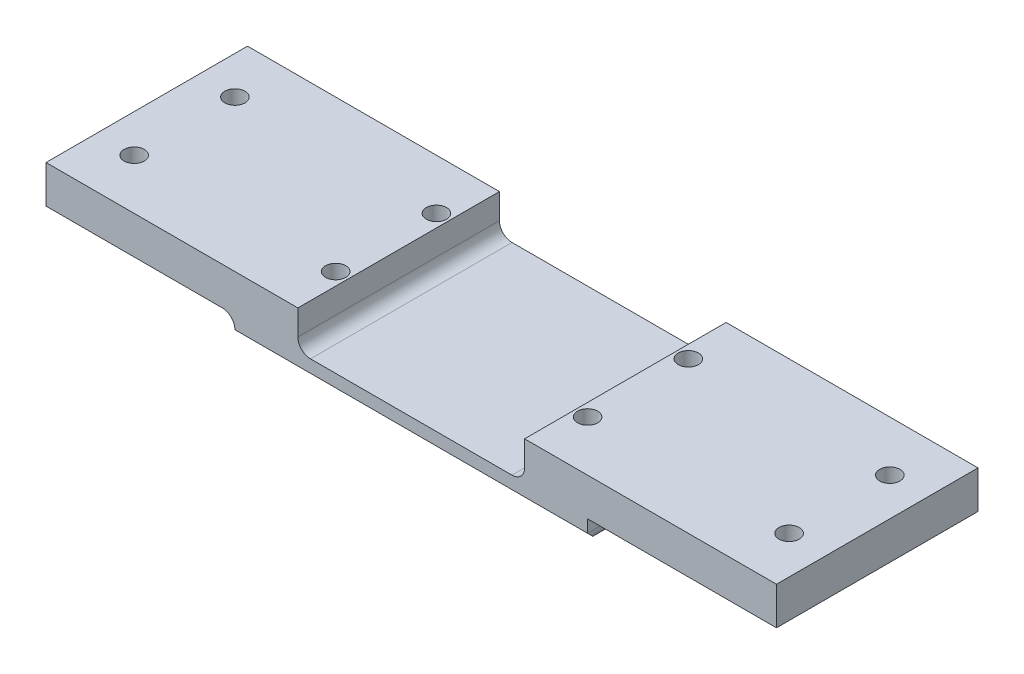
ISO-10303-21;
HEADER;
FILE_DESCRIPTION(('STEP AP214'),'2;1');
FILE_NAME('part.step','',(''),(''),'','','');
FILE_SCHEMA(('AUTOMOTIVE_DESIGN { 1 0 10303 214 1 1 1 1 }'));
ENDSEC;
DATA;
#1=APPLICATION_CONTEXT('core data for automotive mechanical design processes');
#2=APPLICATION_PROTOCOL_DEFINITION('international standard','automotive_design',2000,#1);
#3=PRODUCT_CONTEXT('',#1,'mechanical');
#4=PRODUCT('Part','Part','',(#3));
#5=PRODUCT_RELATED_PRODUCT_CATEGORY('part','',(#4));
#6=PRODUCT_DEFINITION_FORMATION('','',#4);
#7=PRODUCT_DEFINITION_CONTEXT('part definition',#1,'design');
#8=PRODUCT_DEFINITION('design','',#6,#7);
#9=PRODUCT_DEFINITION_SHAPE('','',#8);
#10=(LENGTH_UNIT() NAMED_UNIT(*) SI_UNIT(.MILLI.,.METRE.));
#11=(NAMED_UNIT(*) PLANE_ANGLE_UNIT() SI_UNIT($,.RADIAN.));
#12=(NAMED_UNIT(*) SI_UNIT($,.STERADIAN.) SOLID_ANGLE_UNIT());
#13=UNCERTAINTY_MEASURE_WITH_UNIT(LENGTH_MEASURE(1.E-05),#10,'distance_accuracy_value','');
#14=(GEOMETRIC_REPRESENTATION_CONTEXT(3) GLOBAL_UNCERTAINTY_ASSIGNED_CONTEXT((#13)) GLOBAL_UNIT_ASSIGNED_CONTEXT((#10,
#11,#12)) REPRESENTATION_CONTEXT('',''));
#15=CARTESIAN_POINT('',(0.,0.,0.));
#16=DIRECTION('',(0.,0.,1.));
#17=DIRECTION('',(1.,0.,0.));
#18=AXIS2_PLACEMENT_3D('',#15,#16,#17);
#19=CARTESIAN_POINT('',(0.,9.525,0.));
#20=DIRECTION('',(0.,-1.,0.));
#21=DIRECTION('',(0.,0.,-1.));
#22=AXIS2_PLACEMENT_3D('',#19,#20,#21);
#23=PLANE('',#22);
#24=CARTESIAN_POINT('',(123.825,9.525,-38.1));
#25=DIRECTION('',(0.,1.,0.));
#26=DIRECTION('',(0.,0.,1.));
#27=AXIS2_PLACEMENT_3D('',#24,#25,#26);
#28=CIRCLE('',#27,2.55270000000001);
#29=CARTESIAN_POINT('',(123.825,9.525,-35.5473));
#30=VERTEX_POINT('',#29);
#31=EDGE_CURVE('E392',#30,#30,#28,.T.);
#32=ORIENTED_EDGE('',*,*,#31,.F.);
#33=EDGE_LOOP('',(#32));
#34=FACE_BOUND('',#33,.T.);
#35=CARTESIAN_POINT('',(123.825,9.525,-12.7));
#36=DIRECTION('',(0.,1.,0.));
#37=DIRECTION('',(0.,0.,1.));
#38=AXIS2_PLACEMENT_3D('',#35,#36,#37);
#39=CIRCLE('',#38,2.55270000000001);
#40=CARTESIAN_POINT('',(123.825,9.525,-10.1473));
#41=VERTEX_POINT('',#40);
#42=EDGE_CURVE('E398',#41,#41,#39,.T.);
#43=ORIENTED_EDGE('',*,*,#42,.F.);
#44=EDGE_LOOP('',(#43));
#45=FACE_BOUND('',#44,.T.);
#46=CARTESIAN_POINT('',(174.625,9.525,-12.7));
#47=DIRECTION('',(0.,1.,0.));
#48=DIRECTION('',(0.,0.,1.));
#49=AXIS2_PLACEMENT_3D('',#46,#47,#48);
#50=CIRCLE('',#49,2.55269999999999);
#51=CARTESIAN_POINT('',(174.625,9.525,-10.1473));
#52=VERTEX_POINT('',#51);
#53=EDGE_CURVE('E404',#52,#52,#50,.T.);
#54=ORIENTED_EDGE('',*,*,#53,.F.);
#55=EDGE_LOOP('',(#54));
#56=FACE_BOUND('',#55,.T.);
#57=CARTESIAN_POINT('',(174.625,9.525,-38.1));
#58=DIRECTION('',(0.,1.,0.));
#59=DIRECTION('',(0.,0.,1.));
#60=AXIS2_PLACEMENT_3D('',#57,#58,#59);
#61=CIRCLE('',#60,2.55269999999999);
#62=CARTESIAN_POINT('',(174.625,9.525,-35.5473));
#63=VERTEX_POINT('',#62);
#64=EDGE_CURVE('E410',#63,#63,#61,.T.);
#65=ORIENTED_EDGE('',*,*,#64,.F.);
#66=EDGE_LOOP('',(#65));
#67=FACE_BOUND('',#66,.T.);
#68=DIRECTION('',(-1.,0.,0.));
#69=VECTOR('',#68,1.);
#70=CARTESIAN_POINT('',(0.,9.525,-50.8));
#71=LINE('',#70,#69);
#72=CARTESIAN_POINT('',(184.15,9.525,-50.8));
#73=VERTEX_POINT('',#72);
#74=CARTESIAN_POINT('',(120.65,9.525,-50.8));
#75=VERTEX_POINT('',#74);
#76=EDGE_CURVE('E155',#73,#75,#71,.T.);
#77=ORIENTED_EDGE('',*,*,#76,.T.);
#78=DIRECTION('',(0.,0.,-1.));
#79=VECTOR('',#78,1.);
#80=CARTESIAN_POINT('',(120.65,9.525,-50.8));
#81=LINE('',#80,#79);
#82=CARTESIAN_POINT('',(120.65,9.525,0.));
#83=VERTEX_POINT('',#82);
#84=EDGE_CURVE('E164',#83,#75,#81,.T.);
#85=ORIENTED_EDGE('',*,*,#84,.F.);
#86=DIRECTION('',(1.,0.,0.));
#87=VECTOR('',#86,1.);
#88=CARTESIAN_POINT('',(0.,9.525,0.));
#89=LINE('',#88,#87);
#90=CARTESIAN_POINT('',(184.15,9.525,0.));
#91=VERTEX_POINT('',#90);
#92=EDGE_CURVE('E275',#83,#91,#89,.T.);
#93=ORIENTED_EDGE('',*,*,#92,.T.);
#94=DIRECTION('',(0.,0.,-1.));
#95=VECTOR('',#94,1.);
#96=CARTESIAN_POINT('',(184.15,9.525,0.));
#97=LINE('',#96,#95);
#98=EDGE_CURVE('E174',#91,#73,#97,.T.);
#99=ORIENTED_EDGE('',*,*,#98,.T.);
#100=EDGE_LOOP('',(#77,#85,#93,#99));
#101=FACE_BOUND('',#100,.T.);
#102=ADVANCED_FACE('F37',(#34,#45,#56,#67,#101),#23,.F.);
#103=CARTESIAN_POINT('',(0.,0.,0.));
#104=DIRECTION('',(0.,-1.,0.));
#105=DIRECTION('',(0.,0.,-1.));
#106=AXIS2_PLACEMENT_3D('',#103,#104,#105);
#107=PLANE('',#106);
#108=CARTESIAN_POINT('',(9.52500000000001,0.,-38.1));
#109=DIRECTION('',(0.,-1.,0.));
#110=DIRECTION('',(0.,0.,-1.));
#111=AXIS2_PLACEMENT_3D('',#108,#109,#110);
#112=CIRCLE('',#111,2.5527);
#113=CARTESIAN_POINT('',(9.52500000000001,0.,-40.6527));
#114=VERTEX_POINT('',#113);
#115=EDGE_CURVE('E370',#114,#114,#112,.T.);
#116=ORIENTED_EDGE('',*,*,#115,.F.);
#117=EDGE_LOOP('',(#116));
#118=FACE_BOUND('',#117,.T.);
#119=CARTESIAN_POINT('',(9.525,0.,-12.7));
#120=DIRECTION('',(0.,-1.,0.));
#121=DIRECTION('',(0.,0.,-1.));
#122=AXIS2_PLACEMENT_3D('',#119,#120,#121);
#123=CIRCLE('',#122,2.5527);
#124=CARTESIAN_POINT('',(9.525,0.,-15.2527));
#125=VERTEX_POINT('',#124);
#126=EDGE_CURVE('E374',#125,#125,#123,.T.);
#127=ORIENTED_EDGE('',*,*,#126,.F.);
#128=EDGE_LOOP('',(#127));
#129=FACE_BOUND('',#128,.T.);
#130=DIRECTION('',(-1.,0.,0.));
#131=VECTOR('',#130,1.);
#132=CARTESIAN_POINT('',(0.,0.,-50.8));
#133=LINE('',#132,#131);
#134=CARTESIAN_POINT('',(44.45,0.,-50.8));
#135=VERTEX_POINT('',#134);
#136=CARTESIAN_POINT('',(0.,0.,-50.8));
#137=VERTEX_POINT('',#136);
#138=EDGE_CURVE('E195',#135,#137,#133,.T.);
#139=ORIENTED_EDGE('',*,*,#138,.F.);
#140=DIRECTION('',(0.,0.,1.));
#141=VECTOR('',#140,1.);
#142=CARTESIAN_POINT('',(44.45,0.,0.));
#143=LINE('',#142,#141);
#144=CARTESIAN_POINT('',(44.45,0.,0.));
#145=VERTEX_POINT('',#144);
#146=EDGE_CURVE('E207',#135,#145,#143,.T.);
#147=ORIENTED_EDGE('',*,*,#146,.T.);
#148=DIRECTION('',(1.,0.,0.));
#149=VECTOR('',#148,1.);
#150=CARTESIAN_POINT('',(0.,0.,0.));
#151=LINE('',#150,#149);
#152=CARTESIAN_POINT('',(0.,0.,0.));
#153=VERTEX_POINT('',#152);
#154=EDGE_CURVE('E190',#153,#145,#151,.T.);
#155=ORIENTED_EDGE('',*,*,#154,.F.);
#156=DIRECTION('',(0.,0.,1.));
#157=VECTOR('',#156,1.);
#158=CARTESIAN_POINT('',(0.,0.,0.));
#159=LINE('',#158,#157);
#160=EDGE_CURVE('E185',#137,#153,#159,.T.);
#161=ORIENTED_EDGE('',*,*,#160,.F.);
#162=EDGE_LOOP('',(#139,#147,#155,#161));
#163=FACE_BOUND('',#162,.T.);
#164=ADVANCED_FACE('F291',(#118,#129,#163),#107,.T.);
#165=CARTESIAN_POINT('',(0.,9.525,0.));
#166=DIRECTION('',(1.,0.,0.));
#167=DIRECTION('',(0.,0.,-1.));
#168=AXIS2_PLACEMENT_3D('',#165,#166,#167);
#169=PLANE('',#168);
#170=ORIENTED_EDGE('',*,*,#160,.T.);
#171=DIRECTION('',(0.,-1.,0.));
#172=VECTOR('',#171,1.);
#173=CARTESIAN_POINT('',(0.,9.525,0.));
#174=LINE('',#173,#172);
#175=CARTESIAN_POINT('',(0.,9.525,0.));
#176=VERTEX_POINT('',#175);
#177=EDGE_CURVE('E204',#176,#153,#174,.T.);
#178=ORIENTED_EDGE('',*,*,#177,.F.);
#179=DIRECTION('',(0.,0.,1.));
#180=VECTOR('',#179,1.);
#181=CARTESIAN_POINT('',(0.,9.525,0.));
#182=LINE('',#181,#180);
#183=CARTESIAN_POINT('',(0.,9.525,-50.8));
#184=VERTEX_POINT('',#183);
#185=EDGE_CURVE('E198',#184,#176,#182,.T.);
#186=ORIENTED_EDGE('',*,*,#185,.F.);
#187=DIRECTION('',(0.,-1.,0.));
#188=VECTOR('',#187,1.);
#189=CARTESIAN_POINT('',(0.,9.525,-50.8));
#190=LINE('',#189,#188);
#191=EDGE_CURVE('E176',#184,#137,#190,.T.);
#192=ORIENTED_EDGE('',*,*,#191,.T.);
#193=EDGE_LOOP('',(#170,#178,#186,#192));
#194=FACE_BOUND('',#193,.T.);
#195=ADVANCED_FACE('F305',(#194),#169,.F.);
#196=CARTESIAN_POINT('',(0.,9.525,0.));
#197=DIRECTION('',(0.,0.,-1.));
#198=DIRECTION('',(-1.,0.,0.));
#199=AXIS2_PLACEMENT_3D('',#196,#197,#198);
#200=PLANE('',#199);
#201=CARTESIAN_POINT('',(44.45,-3.175,0.));
#202=DIRECTION('',(0.,0.,-1.));
#203=DIRECTION('',(-1.,0.,0.));
#204=AXIS2_PLACEMENT_3D('',#201,#202,#203);
#205=CIRCLE('',#204,3.175);
#206=CARTESIAN_POINT('',(47.625,-3.17499999999999,0.));
#207=VERTEX_POINT('',#206);
#208=EDGE_CURVE('E230',#145,#207,#205,.T.);
#209=ORIENTED_EDGE('',*,*,#208,.T.);
#210=DIRECTION('',(1.,0.,0.));
#211=VECTOR('',#210,1.);
#212=CARTESIAN_POINT('',(133.35,-3.17499999999998,0.));
#213=LINE('',#212,#211);
#214=CARTESIAN_POINT('',(136.525,-3.175,0.));
#215=VERTEX_POINT('',#214);
#216=EDGE_CURVE('E242',#207,#215,#213,.T.);
#217=ORIENTED_EDGE('',*,*,#216,.T.);
#218=DIRECTION('',(0.,1.,0.));
#219=VECTOR('',#218,1.);
#220=CARTESIAN_POINT('',(136.525,0.,0.));
#221=LINE('',#220,#219);
#222=CARTESIAN_POINT('',(136.525,0.,0.));
#223=VERTEX_POINT('',#222);
#224=EDGE_CURVE('E253',#215,#223,#221,.T.);
#225=ORIENTED_EDGE('',*,*,#224,.T.);
#226=CARTESIAN_POINT('',(184.15,0.,0.));
#227=VERTEX_POINT('',#226);
#228=EDGE_CURVE('E188',#223,#227,#151,.T.);
#229=ORIENTED_EDGE('',*,*,#228,.T.);
#230=DIRECTION('',(0.,-1.,0.));
#231=VECTOR('',#230,1.);
#232=CARTESIAN_POINT('',(184.15,9.525,0.));
#233=LINE('',#232,#231);
#234=EDGE_CURVE('E201',#91,#227,#233,.T.);
#235=ORIENTED_EDGE('',*,*,#234,.F.);
#236=ORIENTED_EDGE('',*,*,#92,.F.);
#237=DIRECTION('',(0.,1.,0.));
#238=VECTOR('',#237,1.);
#239=CARTESIAN_POINT('',(120.65,0.,0.));
#240=LINE('',#239,#238);
#241=CARTESIAN_POINT('',(120.65,3.175,0.));
#242=VERTEX_POINT('',#241);
#243=EDGE_CURVE('E167',#242,#83,#240,.T.);
#244=ORIENTED_EDGE('',*,*,#243,.F.);
#245=CARTESIAN_POINT('',(117.475,3.175,0.));
#246=DIRECTION('',(0.,0.,-1.));
#247=DIRECTION('',(-1.,0.,0.));
#248=AXIS2_PLACEMENT_3D('',#245,#246,#247);
#249=CIRCLE('',#248,3.175);
#250=CARTESIAN_POINT('',(117.475,0.,0.));
#251=VERTEX_POINT('',#250);
#252=EDGE_CURVE('E240',#242,#251,#249,.T.);
#253=ORIENTED_EDGE('',*,*,#252,.T.);
#254=DIRECTION('',(1.,0.,0.));
#255=VECTOR('',#254,1.);
#256=CARTESIAN_POINT('',(120.65,0.,0.));
#257=LINE('',#256,#255);
#258=CARTESIAN_POINT('',(66.675,0.,0.));
#259=VERTEX_POINT('',#258);
#260=EDGE_CURVE('E161',#259,#251,#257,.T.);
#261=ORIENTED_EDGE('',*,*,#260,.F.);
#262=CARTESIAN_POINT('',(66.675,3.175,0.));
#263=DIRECTION('',(0.,0.,-1.));
#264=DIRECTION('',(-1.,0.,0.));
#265=AXIS2_PLACEMENT_3D('',#262,#263,#264);
#266=CIRCLE('',#265,3.175);
#267=CARTESIAN_POINT('',(63.5,3.175,0.));
#268=VERTEX_POINT('',#267);
#269=EDGE_CURVE('E235',#259,#268,#266,.T.);
#270=ORIENTED_EDGE('',*,*,#269,.T.);
#271=DIRECTION('',(0.,1.,0.));
#272=VECTOR('',#271,1.);
#273=CARTESIAN_POINT('',(63.5,0.,0.));
#274=LINE('',#273,#272);
#275=CARTESIAN_POINT('',(63.5,9.525,0.));
#276=VERTEX_POINT('',#275);
#277=EDGE_CURVE('E423',#268,#276,#274,.T.);
#278=ORIENTED_EDGE('',*,*,#277,.T.);
#279=EDGE_CURVE('E276',#176,#276,#89,.T.);
#280=ORIENTED_EDGE('',*,*,#279,.F.);
#281=ORIENTED_EDGE('',*,*,#177,.T.);
#282=ORIENTED_EDGE('',*,*,#154,.T.);
#283=EDGE_LOOP('',(#209,#217,#225,#229,#235,#236,#244,#253,#261,#270,#278,#280,#281,#282));
#284=FACE_BOUND('',#283,.T.);
#285=ADVANCED_FACE('F252',(#284),#200,.F.);
#286=CARTESIAN_POINT('',(184.15,9.525,0.));
#287=DIRECTION('',(-1.,0.,0.));
#288=DIRECTION('',(0.,0.,1.));
#289=AXIS2_PLACEMENT_3D('',#286,#287,#288);
#290=PLANE('',#289);
#291=DIRECTION('',(0.,0.,-1.));
#292=VECTOR('',#291,1.);
#293=CARTESIAN_POINT('',(184.15,0.,0.));
#294=LINE('',#293,#292);
#295=CARTESIAN_POINT('',(184.15,0.,-50.8));
#296=VERTEX_POINT('',#295);
#297=EDGE_CURVE('E193',#227,#296,#294,.T.);
#298=ORIENTED_EDGE('',*,*,#297,.T.);
#299=DIRECTION('',(0.,-1.,0.));
#300=VECTOR('',#299,1.);
#301=CARTESIAN_POINT('',(184.15,9.525,-50.8));
#302=LINE('',#301,#300);
#303=EDGE_CURVE('E180',#73,#296,#302,.T.);
#304=ORIENTED_EDGE('',*,*,#303,.F.);
#305=ORIENTED_EDGE('',*,*,#98,.F.);
#306=ORIENTED_EDGE('',*,*,#234,.T.);
#307=EDGE_LOOP('',(#298,#304,#305,#306));
#308=FACE_BOUND('',#307,.T.);
#309=ADVANCED_FACE('F283',(#308),#290,.F.);
#310=CARTESIAN_POINT('',(0.,9.525,-50.8));
#311=DIRECTION('',(0.,0.,1.));
#312=DIRECTION('',(1.,0.,0.));
#313=AXIS2_PLACEMENT_3D('',#310,#311,#312);
#314=PLANE('',#313);
#315=DIRECTION('',(-1.,0.,0.));
#316=VECTOR('',#315,1.);
#317=CARTESIAN_POINT('',(47.625,-6.35,-50.8));
#318=LINE('',#317,#316);
#319=CARTESIAN_POINT('',(133.35,-6.34999999999999,-50.8));
#320=VERTEX_POINT('',#319);
#321=CARTESIAN_POINT('',(50.8,-6.35,-50.8));
#322=VERTEX_POINT('',#321);
#323=EDGE_CURVE('E189',#320,#322,#318,.T.);
#324=ORIENTED_EDGE('',*,*,#323,.T.);
#325=CARTESIAN_POINT('',(50.8,-3.175,-50.8));
#326=DIRECTION('',(0.,0.,1.));
#327=DIRECTION('',(1.,0.,0.));
#328=AXIS2_PLACEMENT_3D('',#325,#326,#327);
#329=CIRCLE('',#328,3.175);
#330=CARTESIAN_POINT('',(47.625,-3.17499999999999,-50.8));
#331=VERTEX_POINT('',#330);
#332=EDGE_CURVE('E216',#322,#331,#329,.F.);
#333=ORIENTED_EDGE('',*,*,#332,.T.);
#334=CARTESIAN_POINT('',(44.45,-3.175,-50.8));
#335=DIRECTION('',(0.,0.,1.));
#336=DIRECTION('',(1.,0.,0.));
#337=AXIS2_PLACEMENT_3D('',#334,#335,#336);
#338=CIRCLE('',#337,3.175);
#339=EDGE_CURVE('E233',#331,#135,#338,.T.);
#340=ORIENTED_EDGE('',*,*,#339,.T.);
#341=ORIENTED_EDGE('',*,*,#138,.T.);
#342=ORIENTED_EDGE('',*,*,#191,.F.);
#343=CARTESIAN_POINT('',(63.5,9.525,-50.8));
#344=VERTEX_POINT('',#343);
#345=EDGE_CURVE('E177',#344,#184,#71,.T.);
#346=ORIENTED_EDGE('',*,*,#345,.F.);
#347=DIRECTION('',(0.,1.,0.));
#348=VECTOR('',#347,1.);
#349=CARTESIAN_POINT('',(63.5,0.,-50.8));
#350=LINE('',#349,#348);
#351=CARTESIAN_POINT('',(63.5,3.175,-50.8));
#352=VERTEX_POINT('',#351);
#353=EDGE_CURVE('E160',#352,#344,#350,.T.);
#354=ORIENTED_EDGE('',*,*,#353,.F.);
#355=CARTESIAN_POINT('',(66.675,3.175,-50.8));
#356=DIRECTION('',(0.,0.,1.));
#357=DIRECTION('',(1.,0.,0.));
#358=AXIS2_PLACEMENT_3D('',#355,#356,#357);
#359=CIRCLE('',#358,3.175);
#360=CARTESIAN_POINT('',(66.675,0.,-50.8));
#361=VERTEX_POINT('',#360);
#362=EDGE_CURVE('E237',#352,#361,#359,.T.);
#363=ORIENTED_EDGE('',*,*,#362,.T.);
#364=DIRECTION('',(-1.,0.,0.));
#365=VECTOR('',#364,1.);
#366=CARTESIAN_POINT('',(120.65,0.,-50.8));
#367=LINE('',#366,#365);
#368=CARTESIAN_POINT('',(117.475,0.,-50.8));
#369=VERTEX_POINT('',#368);
#370=EDGE_CURVE('E415',#369,#361,#367,.T.);
#371=ORIENTED_EDGE('',*,*,#370,.F.);
#372=CARTESIAN_POINT('',(117.475,3.175,-50.8));
#373=DIRECTION('',(0.,0.,1.));
#374=DIRECTION('',(1.,0.,0.));
#375=AXIS2_PLACEMENT_3D('',#372,#373,#374);
#376=CIRCLE('',#375,3.175);
#377=CARTESIAN_POINT('',(120.65,3.175,-50.8));
#378=VERTEX_POINT('',#377);
#379=EDGE_CURVE('E157',#369,#378,#376,.T.);
#380=ORIENTED_EDGE('',*,*,#379,.T.);
#381=DIRECTION('',(0.,1.,0.));
#382=VECTOR('',#381,1.);
#383=CARTESIAN_POINT('',(120.65,0.,-50.8));
#384=LINE('',#383,#382);
#385=EDGE_CURVE('E149',#378,#75,#384,.T.);
#386=ORIENTED_EDGE('',*,*,#385,.T.);
#387=ORIENTED_EDGE('',*,*,#76,.F.);
#388=ORIENTED_EDGE('',*,*,#303,.T.);
#389=CARTESIAN_POINT('',(136.525,0.,-50.8));
#390=VERTEX_POINT('',#389);
#391=EDGE_CURVE('E196',#296,#390,#133,.T.);
#392=ORIENTED_EDGE('',*,*,#391,.T.);
#393=DIRECTION('',(0.,-1.,0.));
#394=VECTOR('',#393,1.);
#395=CARTESIAN_POINT('',(136.525,0.,-50.8));
#396=LINE('',#395,#394);
#397=CARTESIAN_POINT('',(136.525,-3.175,-50.8));
#398=VERTEX_POINT('',#397);
#399=EDGE_CURVE('E268',#390,#398,#396,.T.);
#400=ORIENTED_EDGE('',*,*,#399,.T.);
#401=CARTESIAN_POINT('',(133.35,-3.17499999999999,-50.8));
#402=DIRECTION('',(0.,0.,1.));
#403=DIRECTION('',(1.,0.,0.));
#404=AXIS2_PLACEMENT_3D('',#401,#402,#403);
#405=CIRCLE('',#404,3.175);
#406=EDGE_CURVE('E214',#398,#320,#405,.F.);
#407=ORIENTED_EDGE('',*,*,#406,.T.);
#408=EDGE_LOOP('',(#324,#333,#340,#341,#342,#346,#354,#363,#371,#380,#386,#387,#388,#392,#400,#407));
#409=FACE_BOUND('',#408,.T.);
#410=ADVANCED_FACE('F152',(#409),#314,.F.);
#411=CARTESIAN_POINT('',(9.52500000000001,9.525,-38.1));
#412=DIRECTION('',(0.,1.,0.));
#413=DIRECTION('',(0.,0.,1.));
#414=AXIS2_PLACEMENT_3D('',#411,#412,#413);
#415=CIRCLE('',#414,2.5527);
#416=CARTESIAN_POINT('',(9.52500000000001,9.525,-35.5473));
#417=VERTEX_POINT('',#416);
#418=EDGE_CURVE('E246',#417,#417,#415,.T.);
#419=ORIENTED_EDGE('',*,*,#418,.F.);
#420=EDGE_LOOP('',(#419));
#421=FACE_BOUND('',#420,.T.);
#422=CARTESIAN_POINT('',(9.525,9.525,-12.7));
#423=DIRECTION('',(0.,1.,0.));
#424=DIRECTION('',(0.,0.,1.));
#425=AXIS2_PLACEMENT_3D('',#422,#423,#424);
#426=CIRCLE('',#425,2.5527);
#427=CARTESIAN_POINT('',(9.525,9.525,-10.1473));
#428=VERTEX_POINT('',#427);
#429=EDGE_CURVE('E371',#428,#428,#426,.T.);
#430=ORIENTED_EDGE('',*,*,#429,.F.);
#431=EDGE_LOOP('',(#430));
#432=FACE_BOUND('',#431,.T.);
#433=CARTESIAN_POINT('',(60.325,9.525,-12.7));
#434=DIRECTION('',(0.,1.,0.));
#435=DIRECTION('',(0.,0.,1.));
#436=AXIS2_PLACEMENT_3D('',#433,#434,#435);
#437=CIRCLE('',#436,2.5527);
#438=CARTESIAN_POINT('',(60.325,9.525,-10.1473));
#439=VERTEX_POINT('',#438);
#440=EDGE_CURVE('E380',#439,#439,#437,.T.);
#441=ORIENTED_EDGE('',*,*,#440,.F.);
#442=EDGE_LOOP('',(#441));
#443=FACE_BOUND('',#442,.T.);
#444=CARTESIAN_POINT('',(60.325,9.525,-38.1));
#445=DIRECTION('',(0.,1.,0.));
#446=DIRECTION('',(0.,0.,1.));
#447=AXIS2_PLACEMENT_3D('',#444,#445,#446);
#448=CIRCLE('',#447,2.55270000000001);
#449=CARTESIAN_POINT('',(60.325,9.525,-35.5473));
#450=VERTEX_POINT('',#449);
#451=EDGE_CURVE('E386',#450,#450,#448,.T.);
#452=ORIENTED_EDGE('',*,*,#451,.F.);
#453=EDGE_LOOP('',(#452));
#454=FACE_BOUND('',#453,.T.);
#455=ORIENTED_EDGE('',*,*,#279,.T.);
#456=DIRECTION('',(0.,0.,1.));
#457=VECTOR('',#456,1.);
#458=CARTESIAN_POINT('',(63.5,9.525,-50.8));
#459=LINE('',#458,#457);
#460=EDGE_CURVE('E170',#344,#276,#459,.T.);
#461=ORIENTED_EDGE('',*,*,#460,.F.);
#462=ORIENTED_EDGE('',*,*,#345,.T.);
#463=ORIENTED_EDGE('',*,*,#185,.T.);
#464=EDGE_LOOP('',(#455,#461,#462,#463));
#465=FACE_BOUND('',#464,.T.);
#466=ADVANCED_FACE('F288',(#421,#432,#443,#454,#465),#23,.F.);
#467=CARTESIAN_POINT('',(174.625,0.,-12.7));
#468=DIRECTION('',(0.,-1.,0.));
#469=DIRECTION('',(0.,0.,-1.));
#470=AXIS2_PLACEMENT_3D('',#467,#468,#469);
#471=CIRCLE('',#470,2.55269999999999);
#472=CARTESIAN_POINT('',(174.625,0.,-15.2527));
#473=VERTEX_POINT('',#472);
#474=EDGE_CURVE('E407',#473,#473,#471,.T.);
#475=ORIENTED_EDGE('',*,*,#474,.F.);
#476=EDGE_LOOP('',(#475));
#477=FACE_BOUND('',#476,.T.);
#478=CARTESIAN_POINT('',(174.625,0.,-38.1));
#479=DIRECTION('',(0.,-1.,0.));
#480=DIRECTION('',(0.,0.,-1.));
#481=AXIS2_PLACEMENT_3D('',#478,#479,#480);
#482=CIRCLE('',#481,2.55269999999999);
#483=CARTESIAN_POINT('',(174.625,0.,-40.6527));
#484=VERTEX_POINT('',#483);
#485=EDGE_CURVE('E171',#484,#484,#482,.T.);
#486=ORIENTED_EDGE('',*,*,#485,.F.);
#487=EDGE_LOOP('',(#486));
#488=FACE_BOUND('',#487,.T.);
#489=DIRECTION('',(0.,0.,1.));
#490=VECTOR('',#489,1.);
#491=CARTESIAN_POINT('',(136.525,0.,-139.926497182376));
#492=LINE('',#491,#490);
#493=EDGE_CURVE('E262',#390,#223,#492,.T.);
#494=ORIENTED_EDGE('',*,*,#493,.F.);
#495=ORIENTED_EDGE('',*,*,#391,.F.);
#496=ORIENTED_EDGE('',*,*,#297,.F.);
#497=ORIENTED_EDGE('',*,*,#228,.F.);
#498=EDGE_LOOP('',(#494,#495,#496,#497));
#499=FACE_BOUND('',#498,.T.);
#500=ADVANCED_FACE('F286',(#477,#488,#499),#107,.T.);
#501=CARTESIAN_POINT('',(136.525,0.,-139.926497182376));
#502=DIRECTION('',(1.,0.,0.));
#503=DIRECTION('',(0.,1.,0.));
#504=AXIS2_PLACEMENT_3D('',#501,#502,#503);
#505=PLANE('',#504);
#506=ORIENTED_EDGE('',*,*,#224,.F.);
#507=DIRECTION('',(0.,0.,1.));
#508=VECTOR('',#507,1.);
#509=CARTESIAN_POINT('',(136.525,-3.175,-139.926497182376));
#510=LINE('',#509,#508);
#511=EDGE_CURVE('E218',#215,#398,#510,.F.);
#512=ORIENTED_EDGE('',*,*,#511,.T.);
#513=ORIENTED_EDGE('',*,*,#399,.F.);
#514=ORIENTED_EDGE('',*,*,#493,.T.);
#515=EDGE_LOOP('',(#506,#512,#513,#514));
#516=FACE_BOUND('',#515,.T.);
#517=ADVANCED_FACE('F259',(#516),#505,.T.);
#518=CARTESIAN_POINT('',(47.625,-6.35,-139.926497182376));
#519=DIRECTION('',(0.,-1.,0.));
#520=DIRECTION('',(1.,0.,0.));
#521=AXIS2_PLACEMENT_3D('',#518,#519,#520);
#522=PLANE('',#521);
#523=CARTESIAN_POINT('',(60.325,-6.35,-12.7));
#524=DIRECTION('',(0.,-1.,0.));
#525=DIRECTION('',(1.,0.,0.));
#526=AXIS2_PLACEMENT_3D('',#523,#524,#525);
#527=CIRCLE('',#526,2.5527);
#528=CARTESIAN_POINT('',(62.8777,-6.35,-12.7));
#529=VERTEX_POINT('',#528);
#530=EDGE_CURVE('E383',#529,#529,#527,.T.);
#531=ORIENTED_EDGE('',*,*,#530,.F.);
#532=EDGE_LOOP('',(#531));
#533=FACE_BOUND('',#532,.T.);
#534=CARTESIAN_POINT('',(60.325,-6.35,-38.1));
#535=DIRECTION('',(0.,-1.,0.));
#536=DIRECTION('',(1.,0.,0.));
#537=AXIS2_PLACEMENT_3D('',#534,#535,#536);
#538=CIRCLE('',#537,2.5527);
#539=CARTESIAN_POINT('',(62.8777,-6.35,-38.1));
#540=VERTEX_POINT('',#539);
#541=EDGE_CURVE('E389',#540,#540,#538,.T.);
#542=ORIENTED_EDGE('',*,*,#541,.F.);
#543=EDGE_LOOP('',(#542));
#544=FACE_BOUND('',#543,.T.);
#545=CARTESIAN_POINT('',(123.825,-6.34999999999999,-38.1));
#546=DIRECTION('',(0.,-1.,0.));
#547=DIRECTION('',(1.,0.,0.));
#548=AXIS2_PLACEMENT_3D('',#545,#546,#547);
#549=CIRCLE('',#548,2.55270000000001);
#550=CARTESIAN_POINT('',(126.3777,-6.34999999999999,-38.1));
#551=VERTEX_POINT('',#550);
#552=EDGE_CURVE('E395',#551,#551,#549,.T.);
#553=ORIENTED_EDGE('',*,*,#552,.F.);
#554=EDGE_LOOP('',(#553));
#555=FACE_BOUND('',#554,.T.);
#556=CARTESIAN_POINT('',(123.825,-6.34999999999999,-12.7));
#557=DIRECTION('',(0.,-1.,0.));
#558=DIRECTION('',(1.,0.,0.));
#559=AXIS2_PLACEMENT_3D('',#556,#557,#558);
#560=CIRCLE('',#559,2.55270000000001);
#561=CARTESIAN_POINT('',(126.3777,-6.34999999999999,-12.7));
#562=VERTEX_POINT('',#561);
#563=EDGE_CURVE('E401',#562,#562,#560,.T.);
#564=ORIENTED_EDGE('',*,*,#563,.F.);
#565=EDGE_LOOP('',(#564));
#566=FACE_BOUND('',#565,.T.);
#567=DIRECTION('',(0.,0.,1.));
#568=VECTOR('',#567,1.);
#569=CARTESIAN_POINT('',(133.35,-6.34999999999999,-139.926497182376));
#570=LINE('',#569,#568);
#571=CARTESIAN_POINT('',(133.35,-6.34999999999999,-3.17500000000004));
#572=VERTEX_POINT('',#571);
#573=EDGE_CURVE('E210',#320,#572,#570,.T.);
#574=ORIENTED_EDGE('',*,*,#573,.T.);
#575=DIRECTION('',(-1.,0.,0.));
#576=VECTOR('',#575,1.);
#577=CARTESIAN_POINT('',(50.8,-6.35,-3.17500000000004));
#578=LINE('',#577,#576);
#579=CARTESIAN_POINT('',(50.8,-6.35,-3.17500000000004));
#580=VERTEX_POINT('',#579);
#581=EDGE_CURVE('E45',#572,#580,#578,.T.);
#582=ORIENTED_EDGE('',*,*,#581,.T.);
#583=DIRECTION('',(0.,0.,1.));
#584=VECTOR('',#583,1.);
#585=CARTESIAN_POINT('',(50.8,-6.35,-139.926497182376));
#586=LINE('',#585,#584);
#587=EDGE_CURVE('E212',#580,#322,#586,.F.);
#588=ORIENTED_EDGE('',*,*,#587,.T.);
#589=ORIENTED_EDGE('',*,*,#323,.F.);
#590=EDGE_LOOP('',(#574,#582,#588,#589));
#591=FACE_BOUND('',#590,.T.);
#592=ADVANCED_FACE('F269',(#533,#544,#555,#566,#591),#522,.T.);
#593=CARTESIAN_POINT('',(120.65,0.,-50.8));
#594=DIRECTION('',(1.,0.,0.));
#595=DIRECTION('',(0.,0.,-1.));
#596=AXIS2_PLACEMENT_3D('',#593,#594,#595);
#597=PLANE('',#596);
#598=ORIENTED_EDGE('',*,*,#385,.F.);
#599=DIRECTION('',(0.,0.,-1.));
#600=VECTOR('',#599,1.);
#601=CARTESIAN_POINT('',(120.65,3.175,0.));
#602=LINE('',#601,#600);
#603=EDGE_CURVE('E228',#378,#242,#602,.F.);
#604=ORIENTED_EDGE('',*,*,#603,.T.);
#605=ORIENTED_EDGE('',*,*,#243,.T.);
#606=ORIENTED_EDGE('',*,*,#84,.T.);
#607=EDGE_LOOP('',(#598,#604,#605,#606));
#608=FACE_BOUND('',#607,.T.);
#609=ADVANCED_FACE('F165',(#608),#597,.F.);
#610=CARTESIAN_POINT('',(63.5,0.,-50.8));
#611=DIRECTION('',(-1.,0.,0.));
#612=DIRECTION('',(0.,0.,1.));
#613=AXIS2_PLACEMENT_3D('',#610,#611,#612);
#614=PLANE('',#613);
#615=ORIENTED_EDGE('',*,*,#277,.F.);
#616=DIRECTION('',(0.,0.,1.));
#617=VECTOR('',#616,1.);
#618=CARTESIAN_POINT('',(63.5,3.175,-50.8));
#619=LINE('',#618,#617);
#620=EDGE_CURVE('E226',#268,#352,#619,.F.);
#621=ORIENTED_EDGE('',*,*,#620,.T.);
#622=ORIENTED_EDGE('',*,*,#353,.T.);
#623=ORIENTED_EDGE('',*,*,#460,.T.);
#624=EDGE_LOOP('',(#615,#621,#622,#623));
#625=FACE_BOUND('',#624,.T.);
#626=ADVANCED_FACE('F319',(#625),#614,.F.);
#627=CARTESIAN_POINT('',(0.,0.,0.));
#628=DIRECTION('',(0.,-1.,0.));
#629=DIRECTION('',(0.,0.,-1.));
#630=AXIS2_PLACEMENT_3D('',#627,#628,#629);
#631=PLANE('',#630);
#632=ORIENTED_EDGE('',*,*,#370,.T.);
#633=DIRECTION('',(0.,0.,1.));
#634=VECTOR('',#633,1.);
#635=CARTESIAN_POINT('',(66.675,0.,0.));
#636=LINE('',#635,#634);
#637=EDGE_CURVE('E223',#361,#259,#636,.T.);
#638=ORIENTED_EDGE('',*,*,#637,.T.);
#639=ORIENTED_EDGE('',*,*,#260,.T.);
#640=DIRECTION('',(0.,0.,-1.));
#641=VECTOR('',#640,1.);
#642=CARTESIAN_POINT('',(117.475,0.,-50.8));
#643=LINE('',#642,#641);
#644=EDGE_CURVE('E220',#251,#369,#643,.T.);
#645=ORIENTED_EDGE('',*,*,#644,.T.);
#646=EDGE_LOOP('',(#632,#638,#639,#645));
#647=FACE_BOUND('',#646,.T.);
#648=ADVANCED_FACE('F322',(#647),#631,.F.);
#649=CARTESIAN_POINT('',(174.625,9.525,-38.1));
#650=DIRECTION('',(0.,1.,0.));
#651=DIRECTION('',(0.,0.,1.));
#652=AXIS2_PLACEMENT_3D('',#649,#650,#651);
#653=CYLINDRICAL_SURFACE('',#652,2.55269999999999);
#654=ORIENTED_EDGE('',*,*,#64,.T.);
#655=EDGE_LOOP('',(#654));
#656=FACE_BOUND('',#655,.T.);
#657=ORIENTED_EDGE('',*,*,#485,.T.);
#658=EDGE_LOOP('',(#657));
#659=FACE_BOUND('',#658,.T.);
#660=ADVANCED_FACE('F326',(#656,#659),#653,.F.);
#661=CARTESIAN_POINT('',(174.625,9.525,-12.7));
#662=DIRECTION('',(0.,1.,0.));
#663=DIRECTION('',(0.,0.,1.));
#664=AXIS2_PLACEMENT_3D('',#661,#662,#663);
#665=CYLINDRICAL_SURFACE('',#664,2.55269999999999);
#666=ORIENTED_EDGE('',*,*,#53,.T.);
#667=EDGE_LOOP('',(#666));
#668=FACE_BOUND('',#667,.T.);
#669=ORIENTED_EDGE('',*,*,#474,.T.);
#670=EDGE_LOOP('',(#669));
#671=FACE_BOUND('',#670,.T.);
#672=ADVANCED_FACE('F330',(#668,#671),#665,.F.);
#673=CARTESIAN_POINT('',(123.825,9.525,-12.7));
#674=DIRECTION('',(0.,1.,0.));
#675=DIRECTION('',(0.,0.,1.));
#676=AXIS2_PLACEMENT_3D('',#673,#674,#675);
#677=CYLINDRICAL_SURFACE('',#676,2.55270000000001);
#678=ORIENTED_EDGE('',*,*,#42,.T.);
#679=EDGE_LOOP('',(#678));
#680=FACE_BOUND('',#679,.T.);
#681=ORIENTED_EDGE('',*,*,#563,.T.);
#682=EDGE_LOOP('',(#681));
#683=FACE_BOUND('',#682,.T.);
#684=ADVANCED_FACE('F334',(#680,#683),#677,.F.);
#685=CARTESIAN_POINT('',(123.825,9.525,-38.1));
#686=DIRECTION('',(0.,1.,0.));
#687=DIRECTION('',(0.,0.,1.));
#688=AXIS2_PLACEMENT_3D('',#685,#686,#687);
#689=CYLINDRICAL_SURFACE('',#688,2.55270000000001);
#690=ORIENTED_EDGE('',*,*,#31,.T.);
#691=EDGE_LOOP('',(#690));
#692=FACE_BOUND('',#691,.T.);
#693=ORIENTED_EDGE('',*,*,#552,.T.);
#694=EDGE_LOOP('',(#693));
#695=FACE_BOUND('',#694,.T.);
#696=ADVANCED_FACE('F338',(#692,#695),#689,.F.);
#697=CARTESIAN_POINT('',(60.325,9.525,-38.1));
#698=DIRECTION('',(0.,1.,0.));
#699=DIRECTION('',(0.,0.,1.));
#700=AXIS2_PLACEMENT_3D('',#697,#698,#699);
#701=CYLINDRICAL_SURFACE('',#700,2.5527);
#702=ORIENTED_EDGE('',*,*,#451,.T.);
#703=EDGE_LOOP('',(#702));
#704=FACE_BOUND('',#703,.T.);
#705=ORIENTED_EDGE('',*,*,#541,.T.);
#706=EDGE_LOOP('',(#705));
#707=FACE_BOUND('',#706,.T.);
#708=ADVANCED_FACE('F342',(#704,#707),#701,.F.);
#709=CARTESIAN_POINT('',(60.325,9.525,-12.7));
#710=DIRECTION('',(0.,1.,0.));
#711=DIRECTION('',(0.,0.,1.));
#712=AXIS2_PLACEMENT_3D('',#709,#710,#711);
#713=CYLINDRICAL_SURFACE('',#712,2.5527);
#714=ORIENTED_EDGE('',*,*,#440,.T.);
#715=EDGE_LOOP('',(#714));
#716=FACE_BOUND('',#715,.T.);
#717=ORIENTED_EDGE('',*,*,#530,.T.);
#718=EDGE_LOOP('',(#717));
#719=FACE_BOUND('',#718,.T.);
#720=ADVANCED_FACE('F346',(#716,#719),#713,.F.);
#721=CARTESIAN_POINT('',(9.525,9.525,-12.7));
#722=DIRECTION('',(0.,1.,0.));
#723=DIRECTION('',(0.,0.,1.));
#724=AXIS2_PLACEMENT_3D('',#721,#722,#723);
#725=CYLINDRICAL_SURFACE('',#724,2.5527);
#726=ORIENTED_EDGE('',*,*,#429,.T.);
#727=EDGE_LOOP('',(#726));
#728=FACE_BOUND('',#727,.T.);
#729=ORIENTED_EDGE('',*,*,#126,.T.);
#730=EDGE_LOOP('',(#729));
#731=FACE_BOUND('',#730,.T.);
#732=ADVANCED_FACE('F350',(#728,#731),#725,.F.);
#733=CARTESIAN_POINT('',(9.52500000000001,9.525,-38.1));
#734=DIRECTION('',(0.,1.,0.));
#735=DIRECTION('',(0.,0.,1.));
#736=AXIS2_PLACEMENT_3D('',#733,#734,#735);
#737=CYLINDRICAL_SURFACE('',#736,2.5527);
#738=ORIENTED_EDGE('',*,*,#418,.T.);
#739=EDGE_LOOP('',(#738));
#740=FACE_BOUND('',#739,.T.);
#741=ORIENTED_EDGE('',*,*,#115,.T.);
#742=EDGE_LOOP('',(#741));
#743=FACE_BOUND('',#742,.T.);
#744=ADVANCED_FACE('F354',(#740,#743),#737,.F.);
#745=CARTESIAN_POINT('',(50.8,-3.175,-139.926497182376));
#746=DIRECTION('',(0.,0.,1.));
#747=DIRECTION('',(1.,0.,0.));
#748=AXIS2_PLACEMENT_3D('',#745,#746,#747);
#749=CYLINDRICAL_SURFACE('',#748,3.175);
#750=ORIENTED_EDGE('',*,*,#587,.F.);
#751=CARTESIAN_POINT('',(50.8,-3.175,0.));
#752=DIRECTION('',(0.,-0.707106781186551,0.707106781186544));
#753=DIRECTION('',(0.,0.707106781186544,0.707106781186551));
#754=AXIS2_PLACEMENT_3D('',#751,#752,#753);
#755=ELLIPSE('',#754,4.4901280605346,3.175);
#756=EDGE_CURVE('E11',#580,#207,#755,.F.);
#757=ORIENTED_EDGE('',*,*,#756,.T.);
#758=DIRECTION('',(0.,0.,1.));
#759=VECTOR('',#758,1.);
#760=CARTESIAN_POINT('',(47.625,-3.17499999999999,-139.926497182376));
#761=LINE('',#760,#759);
#762=EDGE_CURVE('E243',#331,#207,#761,.T.);
#763=ORIENTED_EDGE('',*,*,#762,.F.);
#764=ORIENTED_EDGE('',*,*,#332,.F.);
#765=EDGE_LOOP('',(#750,#757,#763,#764));
#766=FACE_BOUND('',#765,.T.);
#767=ADVANCED_FACE('F357',(#766),#749,.T.);
#768=CARTESIAN_POINT('',(44.45,-3.175,0.));
#769=DIRECTION('',(0.,0.,-1.));
#770=DIRECTION('',(-1.,0.,0.));
#771=AXIS2_PLACEMENT_3D('',#768,#769,#770);
#772=CYLINDRICAL_SURFACE('',#771,3.175);
#773=ORIENTED_EDGE('',*,*,#339,.F.);
#774=ORIENTED_EDGE('',*,*,#762,.T.);
#775=ORIENTED_EDGE('',*,*,#208,.F.);
#776=ORIENTED_EDGE('',*,*,#146,.F.);
#777=EDGE_LOOP('',(#773,#774,#775,#776));
#778=FACE_BOUND('',#777,.T.);
#779=ADVANCED_FACE('F362',(#778),#772,.F.);
#780=CARTESIAN_POINT('',(133.35,-3.17499999999999,-139.926497182376));
#781=DIRECTION('',(0.,0.,1.));
#782=DIRECTION('',(1.,0.,0.));
#783=AXIS2_PLACEMENT_3D('',#780,#781,#782);
#784=CYLINDRICAL_SURFACE('',#783,3.175);
#785=ORIENTED_EDGE('',*,*,#511,.F.);
#786=CARTESIAN_POINT('',(133.35,-3.17499999999999,0.));
#787=DIRECTION('',(0.,-0.707106781186551,0.707106781186544));
#788=DIRECTION('',(0.,0.707106781186544,0.707106781186551));
#789=AXIS2_PLACEMENT_3D('',#786,#787,#788);
#790=ELLIPSE('',#789,4.4901280605346,3.175);
#791=EDGE_CURVE('E59',#215,#572,#790,.F.);
#792=ORIENTED_EDGE('',*,*,#791,.T.);
#793=ORIENTED_EDGE('',*,*,#573,.F.);
#794=ORIENTED_EDGE('',*,*,#406,.F.);
#795=EDGE_LOOP('',(#785,#792,#793,#794));
#796=FACE_BOUND('',#795,.T.);
#797=ADVANCED_FACE('F265',(#796),#784,.T.);
#798=CARTESIAN_POINT('',(66.675,3.175,0.));
#799=DIRECTION('',(0.,0.,-1.));
#800=DIRECTION('',(-1.,0.,0.));
#801=AXIS2_PLACEMENT_3D('',#798,#799,#800);
#802=CYLINDRICAL_SURFACE('',#801,3.175);
#803=ORIENTED_EDGE('',*,*,#362,.F.);
#804=ORIENTED_EDGE('',*,*,#620,.F.);
#805=ORIENTED_EDGE('',*,*,#269,.F.);
#806=ORIENTED_EDGE('',*,*,#637,.F.);
#807=EDGE_LOOP('',(#803,#804,#805,#806));
#808=FACE_BOUND('',#807,.T.);
#809=ADVANCED_FACE('F438',(#808),#802,.F.);
#810=CARTESIAN_POINT('',(117.475,3.175,0.));
#811=DIRECTION('',(0.,0.,1.));
#812=DIRECTION('',(1.,0.,0.));
#813=AXIS2_PLACEMENT_3D('',#810,#811,#812);
#814=CYLINDRICAL_SURFACE('',#813,3.175);
#815=ORIENTED_EDGE('',*,*,#252,.F.);
#816=ORIENTED_EDGE('',*,*,#603,.F.);
#817=ORIENTED_EDGE('',*,*,#379,.F.);
#818=ORIENTED_EDGE('',*,*,#644,.F.);
#819=EDGE_LOOP('',(#815,#816,#817,#818));
#820=FACE_BOUND('',#819,.T.);
#821=ADVANCED_FACE('F443',(#820),#814,.F.);
#822=CARTESIAN_POINT('',(0.,-3.17499999999999,0.));
#823=DIRECTION('',(0.,-0.707106781186551,0.707106781186544));
#824=DIRECTION('',(-1.,0.,0.));
#825=AXIS2_PLACEMENT_3D('',#822,#823,#824);
#826=PLANE('',#825);
#827=ORIENTED_EDGE('',*,*,#756,.F.);
#828=ORIENTED_EDGE('',*,*,#581,.F.);
#829=ORIENTED_EDGE('',*,*,#791,.F.);
#830=ORIENTED_EDGE('',*,*,#216,.F.);
#831=EDGE_LOOP('',(#827,#828,#829,#830));
#832=FACE_BOUND('',#831,.T.);
#833=ADVANCED_FACE('F39',(#832),#826,.T.);
#834=CLOSED_SHELL('',(#102,#164,#195,#285,#309,#410,#466,#500,#517,#592,#609,#626,#648,#660,
#672,#684,#696,#708,#720,#732,#744,#767,#779,#797,#809,#821,#833));
#835=MANIFOLD_SOLID_BREP('B2',#834);
#836=ADVANCED_BREP_SHAPE_REPRESENTATION('',(#18,#835),#14);
#837=SHAPE_DEFINITION_REPRESENTATION(#9,#836);
ENDSEC;
END-ISO-10303-21;
